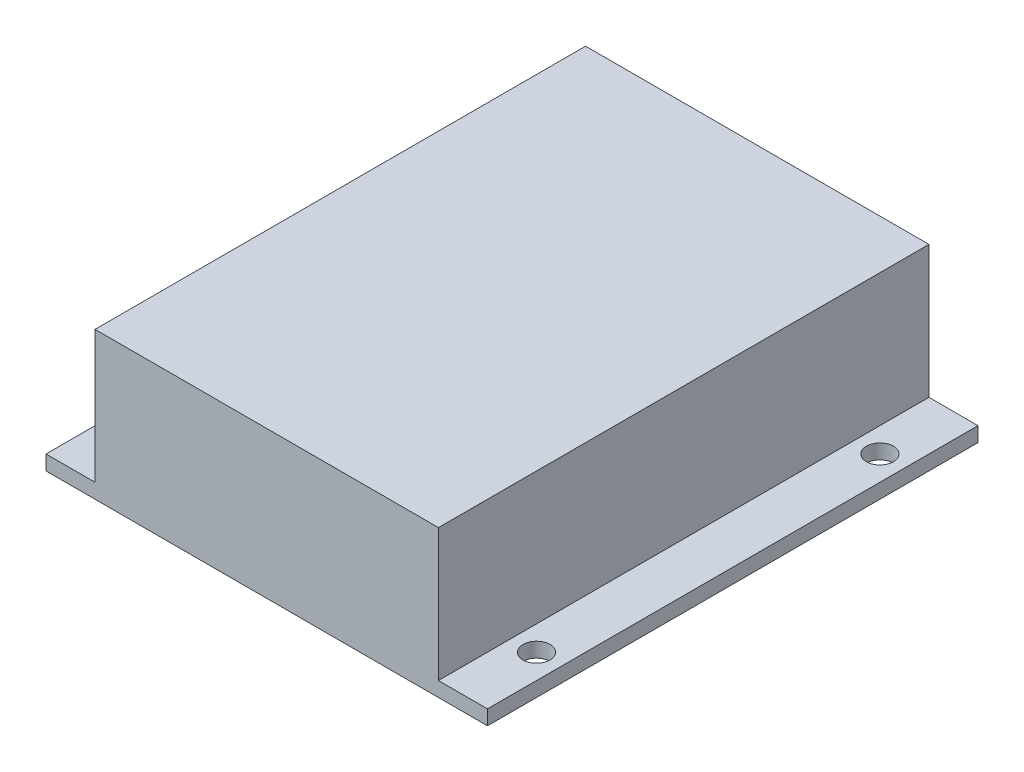
ISO-10303-21;
HEADER;
FILE_DESCRIPTION(('STEP AP214'),'2;1');
FILE_NAME('part.step','',(''),(''),'','','');
FILE_SCHEMA(('AUTOMOTIVE_DESIGN { 1 0 10303 214 1 1 1 1 }'));
ENDSEC;
DATA;
#1=APPLICATION_CONTEXT('core data for automotive mechanical design processes');
#2=APPLICATION_PROTOCOL_DEFINITION('international standard','automotive_design',2000,#1);
#3=PRODUCT_CONTEXT('',#1,'mechanical');
#4=PRODUCT('Part','Part','',(#3));
#5=PRODUCT_RELATED_PRODUCT_CATEGORY('part','',(#4));
#6=PRODUCT_DEFINITION_FORMATION('','',#4);
#7=PRODUCT_DEFINITION_CONTEXT('part definition',#1,'design');
#8=PRODUCT_DEFINITION('design','',#6,#7);
#9=PRODUCT_DEFINITION_SHAPE('','',#8);
#10=(LENGTH_UNIT() NAMED_UNIT(*) SI_UNIT(.MILLI.,.METRE.));
#11=(NAMED_UNIT(*) PLANE_ANGLE_UNIT() SI_UNIT($,.RADIAN.));
#12=(NAMED_UNIT(*) SI_UNIT($,.STERADIAN.) SOLID_ANGLE_UNIT());
#13=UNCERTAINTY_MEASURE_WITH_UNIT(LENGTH_MEASURE(1.E-05),#10,'distance_accuracy_value','');
#14=(GEOMETRIC_REPRESENTATION_CONTEXT(3) GLOBAL_UNCERTAINTY_ASSIGNED_CONTEXT((#13)) GLOBAL_UNIT_ASSIGNED_CONTEXT((#10,
#11,#12)) REPRESENTATION_CONTEXT('',''));
#15=CARTESIAN_POINT('',(0.,0.,0.));
#16=DIRECTION('',(0.,0.,1.));
#17=DIRECTION('',(1.,0.,0.));
#18=AXIS2_PLACEMENT_3D('',#15,#16,#17);
#19=CARTESIAN_POINT('',(0.,30.,-50.));
#20=DIRECTION('',(0.,0.,1.));
#21=DIRECTION('',(1.,0.,0.));
#22=AXIS2_PLACEMENT_3D('',#19,#20,#21);
#23=PLANE('',#22);
#24=DIRECTION('',(-1.,0.,0.));
#25=VECTOR('',#24,1.);
#26=CARTESIAN_POINT('',(0.,0.,-50.));
#27=LINE('',#26,#25);
#28=CARTESIAN_POINT('',(45.,0.,-50.));
#29=VERTEX_POINT('',#28);
#30=CARTESIAN_POINT('',(-45.,0.,-50.));
#31=VERTEX_POINT('',#30);
#32=EDGE_CURVE('E147',#29,#31,#27,.T.);
#33=ORIENTED_EDGE('',*,*,#32,.T.);
#34=DIRECTION('',(0.,-1.,0.));
#35=VECTOR('',#34,1.);
#36=CARTESIAN_POINT('',(-45.,3.,-50.));
#37=LINE('',#36,#35);
#38=CARTESIAN_POINT('',(-45.,3.,-50.));
#39=VERTEX_POINT('',#38);
#40=EDGE_CURVE('E144',#39,#31,#37,.T.);
#41=ORIENTED_EDGE('',*,*,#40,.F.);
#42=DIRECTION('',(-1.,0.,0.));
#43=VECTOR('',#42,1.);
#44=CARTESIAN_POINT('',(0.,3.,-50.));
#45=LINE('',#44,#43);
#46=CARTESIAN_POINT('',(-35.,3.,-50.));
#47=VERTEX_POINT('',#46);
#48=EDGE_CURVE('E134',#47,#39,#45,.T.);
#49=ORIENTED_EDGE('',*,*,#48,.F.);
#50=DIRECTION('',(0.,-1.,0.));
#51=VECTOR('',#50,1.);
#52=CARTESIAN_POINT('',(-35.,30.,-50.));
#53=LINE('',#52,#51);
#54=CARTESIAN_POINT('',(-35.,30.,-50.));
#55=VERTEX_POINT('',#54);
#56=EDGE_CURVE('E11',#55,#47,#53,.T.);
#57=ORIENTED_EDGE('',*,*,#56,.F.);
#58=DIRECTION('',(-1.,0.,0.));
#59=VECTOR('',#58,1.);
#60=CARTESIAN_POINT('',(0.,30.,-50.));
#61=LINE('',#60,#59);
#62=CARTESIAN_POINT('',(35.,30.,-50.));
#63=VERTEX_POINT('',#62);
#64=EDGE_CURVE('E148',#63,#55,#61,.T.);
#65=ORIENTED_EDGE('',*,*,#64,.F.);
#66=DIRECTION('',(0.,-1.,0.));
#67=VECTOR('',#66,1.);
#68=CARTESIAN_POINT('',(35.,30.,-50.));
#69=LINE('',#68,#67);
#70=CARTESIAN_POINT('',(35.,3.,-50.));
#71=VERTEX_POINT('',#70);
#72=EDGE_CURVE('E103',#63,#71,#69,.T.);
#73=ORIENTED_EDGE('',*,*,#72,.T.);
#74=DIRECTION('',(-1.,0.,0.));
#75=VECTOR('',#74,1.);
#76=CARTESIAN_POINT('',(0.,3.,-50.));
#77=LINE('',#76,#75);
#78=CARTESIAN_POINT('',(45.,3.,-50.));
#79=VERTEX_POINT('',#78);
#80=EDGE_CURVE('E113',#79,#71,#77,.T.);
#81=ORIENTED_EDGE('',*,*,#80,.F.);
#82=DIRECTION('',(0.,-1.,0.));
#83=VECTOR('',#82,1.);
#84=CARTESIAN_POINT('',(45.,3.,-50.));
#85=LINE('',#84,#83);
#86=EDGE_CURVE('E120',#79,#29,#85,.T.);
#87=ORIENTED_EDGE('',*,*,#86,.T.);
#88=EDGE_LOOP('',(#33,#41,#49,#57,#65,#73,#81,#87));
#89=FACE_BOUND('',#88,.T.);
#90=ADVANCED_FACE('F32',(#89),#23,.F.);
#91=CARTESIAN_POINT('',(-35.,30.,0.));
#92=DIRECTION('',(1.,0.,0.));
#93=DIRECTION('',(0.,0.,-1.));
#94=AXIS2_PLACEMENT_3D('',#91,#92,#93);
#95=PLANE('',#94);
#96=ORIENTED_EDGE('',*,*,#56,.T.);
#97=DIRECTION('',(0.,0.,1.));
#98=VECTOR('',#97,1.);
#99=CARTESIAN_POINT('',(-35.,3.,0.));
#100=LINE('',#99,#98);
#101=CARTESIAN_POINT('',(-35.,3.,50.));
#102=VERTEX_POINT('',#101);
#103=EDGE_CURVE('E132',#47,#102,#100,.T.);
#104=ORIENTED_EDGE('',*,*,#103,.T.);
#105=DIRECTION('',(0.,-1.,0.));
#106=VECTOR('',#105,1.);
#107=CARTESIAN_POINT('',(-35.,30.,50.));
#108=LINE('',#107,#106);
#109=CARTESIAN_POINT('',(-35.,30.,50.));
#110=VERTEX_POINT('',#109);
#111=EDGE_CURVE('E39',#110,#102,#108,.T.);
#112=ORIENTED_EDGE('',*,*,#111,.F.);
#113=DIRECTION('',(0.,0.,1.));
#114=VECTOR('',#113,1.);
#115=CARTESIAN_POINT('',(-35.,30.,0.));
#116=LINE('',#115,#114);
#117=EDGE_CURVE('E151',#55,#110,#116,.T.);
#118=ORIENTED_EDGE('',*,*,#117,.F.);
#119=EDGE_LOOP('',(#96,#104,#112,#118));
#120=FACE_BOUND('',#119,.T.);
#121=ADVANCED_FACE('F162',(#120),#95,.F.);
#122=CARTESIAN_POINT('',(0.,30.,50.));
#123=DIRECTION('',(0.,0.,1.));
#124=DIRECTION('',(1.,0.,0.));
#125=AXIS2_PLACEMENT_3D('',#122,#123,#124);
#126=PLANE('',#125);
#127=DIRECTION('',(-1.,0.,0.));
#128=VECTOR('',#127,1.);
#129=CARTESIAN_POINT('',(0.,0.,50.));
#130=LINE('',#129,#128);
#131=CARTESIAN_POINT('',(45.,0.,50.));
#132=VERTEX_POINT('',#131);
#133=CARTESIAN_POINT('',(-45.,0.,50.));
#134=VERTEX_POINT('',#133);
#135=EDGE_CURVE('E152',#132,#134,#130,.T.);
#136=ORIENTED_EDGE('',*,*,#135,.F.);
#137=DIRECTION('',(0.,-1.,0.));
#138=VECTOR('',#137,1.);
#139=CARTESIAN_POINT('',(45.,3.,50.));
#140=LINE('',#139,#138);
#141=CARTESIAN_POINT('',(45.,3.,50.));
#142=VERTEX_POINT('',#141);
#143=EDGE_CURVE('E117',#142,#132,#140,.T.);
#144=ORIENTED_EDGE('',*,*,#143,.F.);
#145=DIRECTION('',(-1.,0.,0.));
#146=VECTOR('',#145,1.);
#147=CARTESIAN_POINT('',(0.,3.,50.));
#148=LINE('',#147,#146);
#149=CARTESIAN_POINT('',(35.,3.,50.));
#150=VERTEX_POINT('',#149);
#151=EDGE_CURVE('E110',#142,#150,#148,.T.);
#152=ORIENTED_EDGE('',*,*,#151,.T.);
#153=DIRECTION('',(0.,-1.,0.));
#154=VECTOR('',#153,1.);
#155=CARTESIAN_POINT('',(35.,30.,50.));
#156=LINE('',#155,#154);
#157=CARTESIAN_POINT('',(35.,30.,50.));
#158=VERTEX_POINT('',#157);
#159=EDGE_CURVE('E95',#158,#150,#156,.T.);
#160=ORIENTED_EDGE('',*,*,#159,.F.);
#161=DIRECTION('',(-1.,0.,0.));
#162=VECTOR('',#161,1.);
#163=CARTESIAN_POINT('',(0.,30.,50.));
#164=LINE('',#163,#162);
#165=EDGE_CURVE('E154',#158,#110,#164,.T.);
#166=ORIENTED_EDGE('',*,*,#165,.T.);
#167=ORIENTED_EDGE('',*,*,#111,.T.);
#168=DIRECTION('',(-1.,0.,0.));
#169=VECTOR('',#168,1.);
#170=CARTESIAN_POINT('',(0.,3.,50.));
#171=LINE('',#170,#169);
#172=CARTESIAN_POINT('',(-45.,3.,50.));
#173=VERTEX_POINT('',#172);
#174=EDGE_CURVE('E54',#102,#173,#171,.T.);
#175=ORIENTED_EDGE('',*,*,#174,.T.);
#176=DIRECTION('',(0.,-1.,0.));
#177=VECTOR('',#176,1.);
#178=CARTESIAN_POINT('',(-45.,3.,50.));
#179=LINE('',#178,#177);
#180=EDGE_CURVE('E139',#173,#134,#179,.T.);
#181=ORIENTED_EDGE('',*,*,#180,.T.);
#182=EDGE_LOOP('',(#136,#144,#152,#160,#166,#167,#175,#181));
#183=FACE_BOUND('',#182,.T.);
#184=ADVANCED_FACE('F115',(#183),#126,.T.);
#185=CARTESIAN_POINT('',(35.,30.,0.));
#186=DIRECTION('',(1.,0.,0.));
#187=DIRECTION('',(0.,0.,-1.));
#188=AXIS2_PLACEMENT_3D('',#185,#186,#187);
#189=PLANE('',#188);
#190=DIRECTION('',(0.,0.,1.));
#191=VECTOR('',#190,1.);
#192=CARTESIAN_POINT('',(35.,3.,0.));
#193=LINE('',#192,#191);
#194=EDGE_CURVE('E46',#71,#150,#193,.T.);
#195=ORIENTED_EDGE('',*,*,#194,.F.);
#196=ORIENTED_EDGE('',*,*,#72,.F.);
#197=DIRECTION('',(0.,0.,1.));
#198=VECTOR('',#197,1.);
#199=CARTESIAN_POINT('',(35.,30.,0.));
#200=LINE('',#199,#198);
#201=EDGE_CURVE('E98',#63,#158,#200,.T.);
#202=ORIENTED_EDGE('',*,*,#201,.T.);
#203=ORIENTED_EDGE('',*,*,#159,.T.);
#204=EDGE_LOOP('',(#195,#196,#202,#203));
#205=FACE_BOUND('',#204,.T.);
#206=ADVANCED_FACE('F96',(#205),#189,.T.);
#207=CARTESIAN_POINT('',(0.,30.,0.));
#208=DIRECTION('',(0.,1.,0.));
#209=DIRECTION('',(0.,0.,1.));
#210=AXIS2_PLACEMENT_3D('',#207,#208,#209);
#211=PLANE('',#210);
#212=ORIENTED_EDGE('',*,*,#64,.T.);
#213=ORIENTED_EDGE('',*,*,#117,.T.);
#214=ORIENTED_EDGE('',*,*,#165,.F.);
#215=ORIENTED_EDGE('',*,*,#201,.F.);
#216=EDGE_LOOP('',(#212,#213,#214,#215));
#217=FACE_BOUND('',#216,.T.);
#218=ADVANCED_FACE('F207',(#217),#211,.T.);
#219=CARTESIAN_POINT('',(0.,0.,0.));
#220=DIRECTION('',(0.,1.,0.));
#221=DIRECTION('',(0.,0.,1.));
#222=AXIS2_PLACEMENT_3D('',#219,#220,#221);
#223=PLANE('',#222);
#224=CARTESIAN_POINT('',(-40.,0.,-35.));
#225=DIRECTION('',(0.,-1.,0.));
#226=DIRECTION('',(0.,0.,-1.));
#227=AXIS2_PLACEMENT_3D('',#224,#225,#226);
#228=CIRCLE('',#227,2.75);
#229=CARTESIAN_POINT('',(-40.,0.,-37.75));
#230=VERTEX_POINT('',#229);
#231=EDGE_CURVE('E199',#230,#230,#228,.T.);
#232=ORIENTED_EDGE('',*,*,#231,.F.);
#233=EDGE_LOOP('',(#232));
#234=FACE_BOUND('',#233,.T.);
#235=CARTESIAN_POINT('',(-40.,0.,35.));
#236=DIRECTION('',(0.,-1.,0.));
#237=DIRECTION('',(0.,0.,-1.));
#238=AXIS2_PLACEMENT_3D('',#235,#236,#237);
#239=CIRCLE('',#238,2.75);
#240=CARTESIAN_POINT('',(-40.,0.,32.25));
#241=VERTEX_POINT('',#240);
#242=EDGE_CURVE('E193',#241,#241,#239,.T.);
#243=ORIENTED_EDGE('',*,*,#242,.F.);
#244=EDGE_LOOP('',(#243));
#245=FACE_BOUND('',#244,.T.);
#246=CARTESIAN_POINT('',(40.,0.,-35.));
#247=DIRECTION('',(0.,-1.,0.));
#248=DIRECTION('',(0.,0.,-1.));
#249=AXIS2_PLACEMENT_3D('',#246,#247,#248);
#250=CIRCLE('',#249,2.75);
#251=CARTESIAN_POINT('',(40.,0.,-37.75));
#252=VERTEX_POINT('',#251);
#253=EDGE_CURVE('E187',#252,#252,#250,.T.);
#254=ORIENTED_EDGE('',*,*,#253,.F.);
#255=EDGE_LOOP('',(#254));
#256=FACE_BOUND('',#255,.T.);
#257=CARTESIAN_POINT('',(40.0000000000007,0.,35.));
#258=DIRECTION('',(0.,-1.,0.));
#259=DIRECTION('',(0.,0.,-1.));
#260=AXIS2_PLACEMENT_3D('',#257,#258,#259);
#261=CIRCLE('',#260,2.75);
#262=CARTESIAN_POINT('',(40.0000000000007,0.,32.25));
#263=VERTEX_POINT('',#262);
#264=EDGE_CURVE('E181',#263,#263,#261,.T.);
#265=ORIENTED_EDGE('',*,*,#264,.F.);
#266=EDGE_LOOP('',(#265));
#267=FACE_BOUND('',#266,.T.);
#268=ORIENTED_EDGE('',*,*,#32,.F.);
#269=DIRECTION('',(0.,0.,1.));
#270=VECTOR('',#269,1.);
#271=CARTESIAN_POINT('',(45.,0.,0.));
#272=LINE('',#271,#270);
#273=EDGE_CURVE('E124',#29,#132,#272,.T.);
#274=ORIENTED_EDGE('',*,*,#273,.T.);
#275=ORIENTED_EDGE('',*,*,#135,.T.);
#276=DIRECTION('',(0.,0.,1.));
#277=VECTOR('',#276,1.);
#278=CARTESIAN_POINT('',(-45.,0.,0.));
#279=LINE('',#278,#277);
#280=EDGE_CURVE('E131',#31,#134,#279,.T.);
#281=ORIENTED_EDGE('',*,*,#280,.F.);
#282=EDGE_LOOP('',(#268,#274,#275,#281));
#283=FACE_BOUND('',#282,.T.);
#284=ADVANCED_FACE('F176',(#234,#245,#256,#267,#283),#223,.F.);
#285=CARTESIAN_POINT('',(-45.,3.,0.));
#286=DIRECTION('',(1.,0.,0.));
#287=DIRECTION('',(0.,0.,-1.));
#288=AXIS2_PLACEMENT_3D('',#285,#286,#287);
#289=PLANE('',#288);
#290=ORIENTED_EDGE('',*,*,#280,.T.);
#291=ORIENTED_EDGE('',*,*,#180,.F.);
#292=DIRECTION('',(0.,0.,1.));
#293=VECTOR('',#292,1.);
#294=CARTESIAN_POINT('',(-45.,3.,0.));
#295=LINE('',#294,#293);
#296=EDGE_CURVE('E136',#39,#173,#295,.T.);
#297=ORIENTED_EDGE('',*,*,#296,.F.);
#298=ORIENTED_EDGE('',*,*,#40,.T.);
#299=EDGE_LOOP('',(#290,#291,#297,#298));
#300=FACE_BOUND('',#299,.T.);
#301=ADVANCED_FACE('F171',(#300),#289,.F.);
#302=CARTESIAN_POINT('',(0.,3.,0.));
#303=DIRECTION('',(0.,1.,0.));
#304=DIRECTION('',(0.,0.,1.));
#305=AXIS2_PLACEMENT_3D('',#302,#303,#304);
#306=PLANE('',#305);
#307=CARTESIAN_POINT('',(-40.,3.,-35.));
#308=DIRECTION('',(0.,1.,0.));
#309=DIRECTION('',(0.,0.,1.));
#310=AXIS2_PLACEMENT_3D('',#307,#308,#309);
#311=CIRCLE('',#310,2.75);
#312=CARTESIAN_POINT('',(-40.,3.,-32.25));
#313=VERTEX_POINT('',#312);
#314=EDGE_CURVE('E196',#313,#313,#311,.T.);
#315=ORIENTED_EDGE('',*,*,#314,.F.);
#316=EDGE_LOOP('',(#315));
#317=FACE_BOUND('',#316,.T.);
#318=CARTESIAN_POINT('',(-40.,3.,35.));
#319=DIRECTION('',(0.,1.,0.));
#320=DIRECTION('',(0.,0.,1.));
#321=AXIS2_PLACEMENT_3D('',#318,#319,#320);
#322=CIRCLE('',#321,2.75);
#323=CARTESIAN_POINT('',(-40.,3.,37.75));
#324=VERTEX_POINT('',#323);
#325=EDGE_CURVE('E190',#324,#324,#322,.T.);
#326=ORIENTED_EDGE('',*,*,#325,.F.);
#327=EDGE_LOOP('',(#326));
#328=FACE_BOUND('',#327,.T.);
#329=ORIENTED_EDGE('',*,*,#103,.F.);
#330=ORIENTED_EDGE('',*,*,#48,.T.);
#331=ORIENTED_EDGE('',*,*,#296,.T.);
#332=ORIENTED_EDGE('',*,*,#174,.F.);
#333=EDGE_LOOP('',(#329,#330,#331,#332));
#334=FACE_BOUND('',#333,.T.);
#335=ADVANCED_FACE('F164',(#317,#328,#334),#306,.T.);
#336=CARTESIAN_POINT('',(45.,3.,0.));
#337=DIRECTION('',(1.,0.,0.));
#338=DIRECTION('',(0.,0.,-1.));
#339=AXIS2_PLACEMENT_3D('',#336,#337,#338);
#340=PLANE('',#339);
#341=ORIENTED_EDGE('',*,*,#273,.F.);
#342=ORIENTED_EDGE('',*,*,#86,.F.);
#343=DIRECTION('',(0.,0.,1.));
#344=VECTOR('',#343,1.);
#345=CARTESIAN_POINT('',(45.,3.,0.));
#346=LINE('',#345,#344);
#347=EDGE_CURVE('E118',#79,#142,#346,.T.);
#348=ORIENTED_EDGE('',*,*,#347,.T.);
#349=ORIENTED_EDGE('',*,*,#143,.T.);
#350=EDGE_LOOP('',(#341,#342,#348,#349));
#351=FACE_BOUND('',#350,.T.);
#352=ADVANCED_FACE('F175',(#351),#340,.T.);
#353=CARTESIAN_POINT('',(0.,3.,0.));
#354=DIRECTION('',(0.,1.,0.));
#355=DIRECTION('',(0.,0.,1.));
#356=AXIS2_PLACEMENT_3D('',#353,#354,#355);
#357=PLANE('',#356);
#358=CARTESIAN_POINT('',(40.,3.,-35.));
#359=DIRECTION('',(0.,1.,0.));
#360=DIRECTION('',(0.,0.,1.));
#361=AXIS2_PLACEMENT_3D('',#358,#359,#360);
#362=CIRCLE('',#361,2.75);
#363=CARTESIAN_POINT('',(40.,3.,-32.25));
#364=VERTEX_POINT('',#363);
#365=EDGE_CURVE('E184',#364,#364,#362,.T.);
#366=ORIENTED_EDGE('',*,*,#365,.F.);
#367=EDGE_LOOP('',(#366));
#368=FACE_BOUND('',#367,.T.);
#369=CARTESIAN_POINT('',(40.0000000000007,3.,35.));
#370=DIRECTION('',(0.,1.,0.));
#371=DIRECTION('',(0.,0.,1.));
#372=AXIS2_PLACEMENT_3D('',#369,#370,#371);
#373=CIRCLE('',#372,2.75);
#374=CARTESIAN_POINT('',(40.0000000000007,3.,37.75));
#375=VERTEX_POINT('',#374);
#376=EDGE_CURVE('E127',#375,#375,#373,.T.);
#377=ORIENTED_EDGE('',*,*,#376,.F.);
#378=EDGE_LOOP('',(#377));
#379=FACE_BOUND('',#378,.T.);
#380=ORIENTED_EDGE('',*,*,#80,.T.);
#381=ORIENTED_EDGE('',*,*,#194,.T.);
#382=ORIENTED_EDGE('',*,*,#151,.F.);
#383=ORIENTED_EDGE('',*,*,#347,.F.);
#384=EDGE_LOOP('',(#380,#381,#382,#383));
#385=FACE_BOUND('',#384,.T.);
#386=ADVANCED_FACE('F108',(#368,#379,#385),#357,.T.);
#387=CARTESIAN_POINT('',(40.0000000000007,0.,35.));
#388=DIRECTION('',(0.,-1.,0.));
#389=DIRECTION('',(0.,0.,-1.));
#390=AXIS2_PLACEMENT_3D('',#387,#388,#389);
#391=CYLINDRICAL_SURFACE('',#390,2.75);
#392=ORIENTED_EDGE('',*,*,#376,.T.);
#393=EDGE_LOOP('',(#392));
#394=FACE_BOUND('',#393,.T.);
#395=ORIENTED_EDGE('',*,*,#264,.T.);
#396=EDGE_LOOP('',(#395));
#397=FACE_BOUND('',#396,.T.);
#398=ADVANCED_FACE('F215',(#394,#397),#391,.F.);
#399=CARTESIAN_POINT('',(40.,0.,-35.));
#400=DIRECTION('',(0.,-1.,0.));
#401=DIRECTION('',(0.,0.,-1.));
#402=AXIS2_PLACEMENT_3D('',#399,#400,#401);
#403=CYLINDRICAL_SURFACE('',#402,2.75);
#404=ORIENTED_EDGE('',*,*,#365,.T.);
#405=EDGE_LOOP('',(#404));
#406=FACE_BOUND('',#405,.T.);
#407=ORIENTED_EDGE('',*,*,#253,.T.);
#408=EDGE_LOOP('',(#407));
#409=FACE_BOUND('',#408,.T.);
#410=ADVANCED_FACE('F217',(#406,#409),#403,.F.);
#411=CARTESIAN_POINT('',(-40.,0.,35.));
#412=DIRECTION('',(0.,-1.,0.));
#413=DIRECTION('',(0.,0.,-1.));
#414=AXIS2_PLACEMENT_3D('',#411,#412,#413);
#415=CYLINDRICAL_SURFACE('',#414,2.75);
#416=ORIENTED_EDGE('',*,*,#325,.T.);
#417=EDGE_LOOP('',(#416));
#418=FACE_BOUND('',#417,.T.);
#419=ORIENTED_EDGE('',*,*,#242,.T.);
#420=EDGE_LOOP('',(#419));
#421=FACE_BOUND('',#420,.T.);
#422=ADVANCED_FACE('F224',(#418,#421),#415,.F.);
#423=CARTESIAN_POINT('',(-40.,0.,-35.));
#424=DIRECTION('',(0.,-1.,0.));
#425=DIRECTION('',(0.,0.,-1.));
#426=AXIS2_PLACEMENT_3D('',#423,#424,#425);
#427=CYLINDRICAL_SURFACE('',#426,2.75);
#428=ORIENTED_EDGE('',*,*,#314,.T.);
#429=EDGE_LOOP('',(#428));
#430=FACE_BOUND('',#429,.T.);
#431=ORIENTED_EDGE('',*,*,#231,.T.);
#432=EDGE_LOOP('',(#431));
#433=FACE_BOUND('',#432,.T.);
#434=ADVANCED_FACE('F203',(#430,#433),#427,.F.);
#435=CLOSED_SHELL('',(#90,#121,#184,#206,#218,#284,#301,#335,#352,#386,#398,#410,#422,#434));
#436=MANIFOLD_SOLID_BREP('B2',#435);
#437=ADVANCED_BREP_SHAPE_REPRESENTATION('',(#18,#436),#14);
#438=SHAPE_DEFINITION_REPRESENTATION(#9,#437);
ENDSEC;
END-ISO-10303-21;
